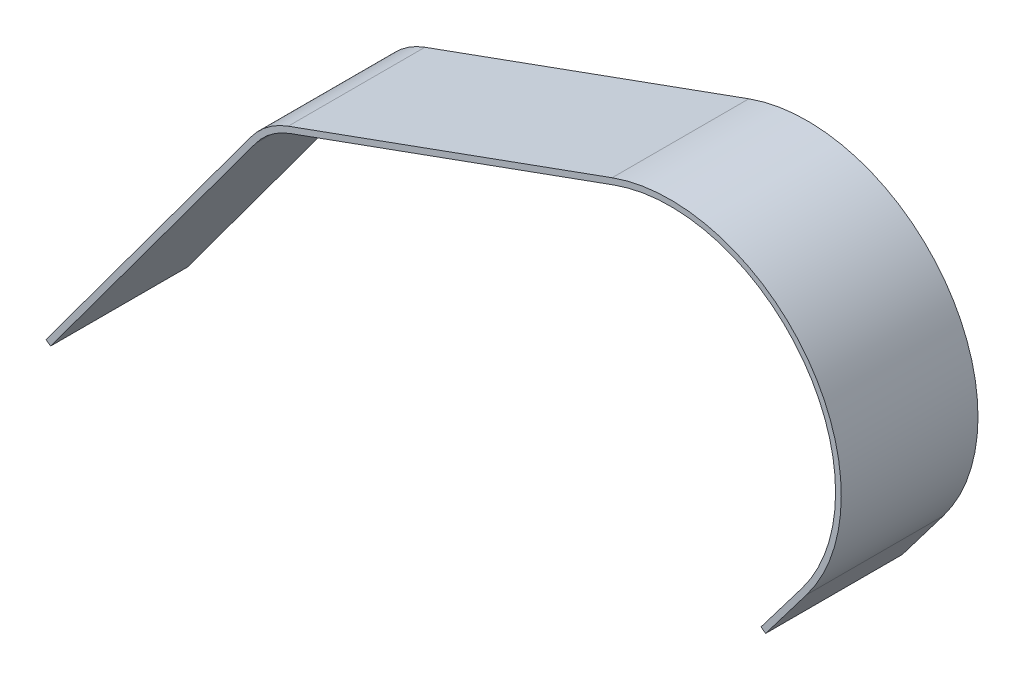
ISO-10303-21;
HEADER;
FILE_DESCRIPTION(('STEP AP214'),'2;1');
FILE_NAME('part.step','',(''),(''),'','','');
FILE_SCHEMA(('AUTOMOTIVE_DESIGN { 1 0 10303 214 1 1 1 1 }'));
ENDSEC;
DATA;
#1=APPLICATION_CONTEXT('core data for automotive mechanical design processes');
#2=APPLICATION_PROTOCOL_DEFINITION('international standard','automotive_design',2000,#1);
#3=PRODUCT_CONTEXT('',#1,'mechanical');
#4=PRODUCT('Part','Part','',(#3));
#5=PRODUCT_RELATED_PRODUCT_CATEGORY('part','',(#4));
#6=PRODUCT_DEFINITION_FORMATION('','',#4);
#7=PRODUCT_DEFINITION_CONTEXT('part definition',#1,'design');
#8=PRODUCT_DEFINITION('design','',#6,#7);
#9=PRODUCT_DEFINITION_SHAPE('','',#8);
#10=(LENGTH_UNIT() NAMED_UNIT(*) SI_UNIT(.MILLI.,.METRE.));
#11=(NAMED_UNIT(*) PLANE_ANGLE_UNIT() SI_UNIT($,.RADIAN.));
#12=(NAMED_UNIT(*) SI_UNIT($,.STERADIAN.) SOLID_ANGLE_UNIT());
#13=UNCERTAINTY_MEASURE_WITH_UNIT(LENGTH_MEASURE(1.E-05),#10,'distance_accuracy_value','');
#14=(GEOMETRIC_REPRESENTATION_CONTEXT(3) GLOBAL_UNCERTAINTY_ASSIGNED_CONTEXT((#13)) GLOBAL_UNIT_ASSIGNED_CONTEXT((#10,
#11,#12)) REPRESENTATION_CONTEXT('',''));
#15=CARTESIAN_POINT('',(0.,0.,0.));
#16=DIRECTION('',(0.,0.,1.));
#17=DIRECTION('',(1.,0.,0.));
#18=AXIS2_PLACEMENT_3D('',#15,#16,#17);
#19=CARTESIAN_POINT('',(-57.2077768085638,-14.4933568152173,76.2));
#20=DIRECTION('',(0.804862618408314,-0.593461174373618,0.));
#21=DIRECTION('',(0.593461174373618,0.804862618408314,0.));
#22=AXIS2_PLACEMENT_3D('',#19,#20,#21);
#23=PLANE('',#22);
#24=DIRECTION('',(-0.593461174373618,-0.804862618408313,0.));
#25=VECTOR('',#24,1.);
#26=CARTESIAN_POINT('',(-57.2077768085638,-14.4933568152173,0.));
#27=LINE('',#26,#25);
#28=CARTESIAN_POINT('',(-57.2077768085638,-14.4933568152173,0.));
#29=VERTEX_POINT('',#28);
#30=CARTESIAN_POINT('',(-171.530725157961,-169.54017626347,0.));
#31=VERTEX_POINT('',#30);
#32=EDGE_CURVE('E170',#29,#31,#27,.T.);
#33=ORIENTED_EDGE('',*,*,#32,.T.);
#34=DIRECTION('',(0.,0.,-1.));
#35=VECTOR('',#34,1.);
#36=CARTESIAN_POINT('',(-171.530725157961,-169.54017626347,76.2));
#37=LINE('',#36,#35);
#38=CARTESIAN_POINT('',(-171.530725157961,-169.54017626347,76.2));
#39=VERTEX_POINT('',#38);
#40=EDGE_CURVE('E11',#39,#31,#37,.T.);
#41=ORIENTED_EDGE('',*,*,#40,.F.);
#42=DIRECTION('',(-0.593461174373618,-0.804862618408313,0.));
#43=VECTOR('',#42,1.);
#44=CARTESIAN_POINT('',(-57.2077768085638,-14.4933568152173,76.2));
#45=LINE('',#44,#43);
#46=CARTESIAN_POINT('',(-57.2077768085638,-14.4933568152173,76.2));
#47=VERTEX_POINT('',#46);
#48=EDGE_CURVE('E114',#47,#39,#45,.T.);
#49=ORIENTED_EDGE('',*,*,#48,.F.);
#50=DIRECTION('',(0.,0.,-1.));
#51=VECTOR('',#50,1.);
#52=CARTESIAN_POINT('',(-57.2077768085638,-14.4933568152173,76.2));
#53=LINE('',#52,#51);
#54=EDGE_CURVE('E166',#47,#29,#53,.T.);
#55=ORIENTED_EDGE('',*,*,#54,.T.);
#56=EDGE_LOOP('',(#33,#41,#49,#55));
#57=FACE_BOUND('',#56,.T.);
#58=ADVANCED_FACE('F45',(#57),#23,.F.);
#59=CARTESIAN_POINT('',(-168.975286344515,-171.424415492106,76.2));
#60=DIRECTION('',(-0.593461174373618,-0.804862618408314,0.));
#61=DIRECTION('',(0.804862618408313,-0.593461174373618,0.));
#62=AXIS2_PLACEMENT_3D('',#59,#60,#61);
#63=PLANE('',#62);
#64=DIRECTION('',(-0.804862618408313,0.593461174373618,0.));
#65=VECTOR('',#64,1.);
#66=CARTESIAN_POINT('',(-168.975286344515,-171.424415492106,0.));
#67=LINE('',#66,#65);
#68=CARTESIAN_POINT('',(-168.975286344515,-171.424415492106,0.));
#69=VERTEX_POINT('',#68);
#70=EDGE_CURVE('E174',#69,#31,#67,.T.);
#71=ORIENTED_EDGE('',*,*,#70,.F.);
#72=DIRECTION('',(0.,0.,-1.));
#73=VECTOR('',#72,1.);
#74=CARTESIAN_POINT('',(-168.975286344515,-171.424415492106,76.2));
#75=LINE('',#74,#73);
#76=CARTESIAN_POINT('',(-168.975286344515,-171.424415492106,76.2));
#77=VERTEX_POINT('',#76);
#78=EDGE_CURVE('E54',#77,#69,#75,.T.);
#79=ORIENTED_EDGE('',*,*,#78,.F.);
#80=DIRECTION('',(-0.804862618408313,0.593461174373618,0.));
#81=VECTOR('',#80,1.);
#82=CARTESIAN_POINT('',(-168.975286344515,-171.424415492106,76.2));
#83=LINE('',#82,#81);
#84=EDGE_CURVE('E257',#77,#39,#83,.T.);
#85=ORIENTED_EDGE('',*,*,#84,.T.);
#86=ORIENTED_EDGE('',*,*,#40,.T.);
#87=EDGE_LOOP('',(#71,#79,#85,#86));
#88=FACE_BOUND('',#87,.T.);
#89=ADVANCED_FACE('F244',(#88),#63,.T.);
#90=CARTESIAN_POINT('',(-54.6523379951174,-16.3775960438536,76.2));
#91=DIRECTION('',(0.804862618408313,-0.593461174373618,0.));
#92=DIRECTION('',(0.593461174373618,0.804862618408313,0.));
#93=AXIS2_PLACEMENT_3D('',#90,#91,#92);
#94=PLANE('',#93);
#95=DIRECTION('',(-0.593461174373618,-0.804862618408314,0.));
#96=VECTOR('',#95,1.);
#97=CARTESIAN_POINT('',(-54.6523379951174,-16.3775960438536,0.));
#98=LINE('',#97,#96);
#99=CARTESIAN_POINT('',(-54.6523379951174,-16.3775960438536,0.));
#100=VERTEX_POINT('',#99);
#101=EDGE_CURVE('E178',#100,#69,#98,.T.);
#102=ORIENTED_EDGE('',*,*,#101,.F.);
#103=DIRECTION('',(0.,0.,-1.));
#104=VECTOR('',#103,1.);
#105=CARTESIAN_POINT('',(-54.6523379951174,-16.3775960438536,76.2));
#106=LINE('',#105,#104);
#107=CARTESIAN_POINT('',(-54.6523379951174,-16.3775960438536,76.2));
#108=VERTEX_POINT('',#107);
#109=EDGE_CURVE('E232',#108,#100,#106,.T.);
#110=ORIENTED_EDGE('',*,*,#109,.F.);
#111=DIRECTION('',(-0.593461174373618,-0.804862618408314,0.));
#112=VECTOR('',#111,1.);
#113=CARTESIAN_POINT('',(-54.6523379951174,-16.3775960438536,76.2));
#114=LINE('',#113,#112);
#115=EDGE_CURVE('E241',#108,#77,#114,.T.);
#116=ORIENTED_EDGE('',*,*,#115,.T.);
#117=ORIENTED_EDGE('',*,*,#78,.T.);
#118=EDGE_LOOP('',(#102,#110,#116,#117));
#119=FACE_BOUND('',#118,.T.);
#120=ADVANCED_FACE('F239',(#119),#94,.T.);
#121=CARTESIAN_POINT('',(-21.4316334203143,-40.8727060161246,76.2));
#122=DIRECTION('',(0.,0.,-1.));
#123=DIRECTION('',(-1.,0.,0.));
#124=AXIS2_PLACEMENT_3D('',#121,#122,#123);
#125=CYLINDRICAL_SURFACE('',#124,41.275);
#126=CARTESIAN_POINT('',(-21.4316334203143,-40.8727060161246,0.));
#127=DIRECTION('',(0.,0.,1.));
#128=DIRECTION('',(1.,0.,0.));
#129=AXIS2_PLACEMENT_3D('',#126,#127,#128);
#130=CIRCLE('',#129,41.275);
#131=CARTESIAN_POINT('',(-35.4870375264377,-2.06457232724997,0.));
#132=VERTEX_POINT('',#131);
#133=EDGE_CURVE('E182',#132,#100,#130,.T.);
#134=ORIENTED_EDGE('',*,*,#133,.F.);
#135=DIRECTION('',(0.,0.,-1.));
#136=VECTOR('',#135,1.);
#137=CARTESIAN_POINT('',(-35.4870375264377,-2.06457232724997,76.2));
#138=LINE('',#137,#136);
#139=CARTESIAN_POINT('',(-35.4870375264377,-2.06457232724997,76.2));
#140=VERTEX_POINT('',#139);
#141=EDGE_CURVE('E229',#140,#132,#138,.T.);
#142=ORIENTED_EDGE('',*,*,#141,.F.);
#143=CARTESIAN_POINT('',(-21.4316334203143,-40.8727060161246,76.2));
#144=DIRECTION('',(0.,0.,1.));
#145=DIRECTION('',(1.,0.,0.));
#146=AXIS2_PLACEMENT_3D('',#143,#144,#145);
#147=CIRCLE('',#146,41.275);
#148=EDGE_CURVE('E254',#140,#108,#147,.T.);
#149=ORIENTED_EDGE('',*,*,#148,.T.);
#150=ORIENTED_EDGE('',*,*,#109,.T.);
#151=EDGE_LOOP('',(#134,#142,#149,#150));
#152=FACE_BOUND('',#151,.T.);
#153=ADVANCED_FACE('F251',(#152),#125,.F.);
#154=CARTESIAN_POINT('',(-35.4870375264377,-2.06457232724998,76.2));
#155=DIRECTION('',(0.340530687004807,-0.940233402516649,0.));
#156=DIRECTION('',(0.940233402516649,0.340530687004807,0.));
#157=AXIS2_PLACEMENT_3D('',#154,#155,#156);
#158=PLANE('',#157);
#159=DIRECTION('',(-0.940233402516649,-0.340530687004807,0.));
#160=VECTOR('',#159,1.);
#161=CARTESIAN_POINT('',(-35.4870375264377,-2.06457232724998,0.));
#162=LINE('',#161,#160);
#163=CARTESIAN_POINT('',(145.033742322665,63.3158587615827,0.));
#164=VERTEX_POINT('',#163);
#165=EDGE_CURVE('E186',#164,#132,#162,.T.);
#166=ORIENTED_EDGE('',*,*,#165,.F.);
#167=DIRECTION('',(0.,0.,-1.));
#168=VECTOR('',#167,1.);
#169=CARTESIAN_POINT('',(145.033742322665,63.3158587615827,76.2));
#170=LINE('',#169,#168);
#171=CARTESIAN_POINT('',(145.033742322665,63.3158587615827,76.2));
#172=VERTEX_POINT('',#171);
#173=EDGE_CURVE('E226',#172,#164,#170,.T.);
#174=ORIENTED_EDGE('',*,*,#173,.F.);
#175=DIRECTION('',(-0.940233402516649,-0.340530687004807,0.));
#176=VECTOR('',#175,1.);
#177=CARTESIAN_POINT('',(-35.4870375264377,-2.06457232724998,76.2));
#178=LINE('',#177,#176);
#179=EDGE_CURVE('E262',#172,#140,#178,.T.);
#180=ORIENTED_EDGE('',*,*,#179,.T.);
#181=ORIENTED_EDGE('',*,*,#141,.T.);
#182=EDGE_LOOP('',(#166,#174,#180,#181));
#183=FACE_BOUND('',#182,.T.);
#184=ADVANCED_FACE('F369',(#183),#158,.T.);
#185=CARTESIAN_POINT('',(176.388105328633,-23.2561317751377,76.2));
#186=DIRECTION('',(0.,0.,-1.));
#187=DIRECTION('',(-1.,0.,0.));
#188=AXIS2_PLACEMENT_3D('',#185,#186,#187);
#189=CYLINDRICAL_SURFACE('',#188,92.075);
#190=CARTESIAN_POINT('',(176.388105328633,-23.2561317751377,0.));
#191=DIRECTION('',(0.,0.,1.));
#192=DIRECTION('',(1.,0.,0.));
#193=AXIS2_PLACEMENT_3D('',#190,#191,#192);
#194=CIRCLE('',#193,92.075);
#195=CARTESIAN_POINT('',(249.735479647556,-78.9155272580188,0.));
#196=VERTEX_POINT('',#195);
#197=EDGE_CURVE('E190',#196,#164,#194,.T.);
#198=ORIENTED_EDGE('',*,*,#197,.F.);
#199=DIRECTION('',(0.,0.,-1.));
#200=VECTOR('',#199,1.);
#201=CARTESIAN_POINT('',(249.735479647556,-78.9155272580188,76.2));
#202=LINE('',#201,#200);
#203=CARTESIAN_POINT('',(249.735479647556,-78.9155272580188,76.2));
#204=VERTEX_POINT('',#203);
#205=EDGE_CURVE('E223',#204,#196,#202,.T.);
#206=ORIENTED_EDGE('',*,*,#205,.F.);
#207=CARTESIAN_POINT('',(176.388105328633,-23.2561317751377,76.2));
#208=DIRECTION('',(0.,0.,1.));
#209=DIRECTION('',(1.,0.,0.));
#210=AXIS2_PLACEMENT_3D('',#207,#208,#209);
#211=CIRCLE('',#210,92.075);
#212=EDGE_CURVE('E269',#204,#172,#211,.T.);
#213=ORIENTED_EDGE('',*,*,#212,.T.);
#214=ORIENTED_EDGE('',*,*,#173,.T.);
#215=EDGE_LOOP('',(#198,#206,#213,#214));
#216=FACE_BOUND('',#215,.T.);
#217=ADVANCED_FACE('F360',(#216),#189,.F.);
#218=CARTESIAN_POINT('',(226.939831580388,-108.9553959472,76.2));
#219=DIRECTION('',(-0.796604662708913,0.604500629735337,0.));
#220=DIRECTION('',(-0.604500629735337,-0.796604662708913,0.));
#221=AXIS2_PLACEMENT_3D('',#218,#219,#220);
#222=PLANE('',#221);
#223=DIRECTION('',(0.604500629735337,0.796604662708913,0.));
#224=VECTOR('',#223,1.);
#225=CARTESIAN_POINT('',(226.939831580388,-108.9553959472,0.));
#226=LINE('',#225,#224);
#227=CARTESIAN_POINT('',(226.939831580388,-108.9553959472,0.));
#228=VERTEX_POINT('',#227);
#229=EDGE_CURVE('E194',#228,#196,#226,.T.);
#230=ORIENTED_EDGE('',*,*,#229,.F.);
#231=DIRECTION('',(0.,0.,-1.));
#232=VECTOR('',#231,1.);
#233=CARTESIAN_POINT('',(226.939831580388,-108.9553959472,76.2));
#234=LINE('',#233,#232);
#235=CARTESIAN_POINT('',(226.939831580388,-108.9553959472,76.2));
#236=VERTEX_POINT('',#235);
#237=EDGE_CURVE('E220',#236,#228,#234,.T.);
#238=ORIENTED_EDGE('',*,*,#237,.F.);
#239=DIRECTION('',(0.604500629735337,0.796604662708913,0.));
#240=VECTOR('',#239,1.);
#241=CARTESIAN_POINT('',(226.939831580388,-108.9553959472,76.2));
#242=LINE('',#241,#240);
#243=EDGE_CURVE('E273',#236,#204,#242,.T.);
#244=ORIENTED_EDGE('',*,*,#243,.T.);
#245=ORIENTED_EDGE('',*,*,#205,.T.);
#246=EDGE_LOOP('',(#230,#238,#244,#245));
#247=FACE_BOUND('',#246,.T.);
#248=ADVANCED_FACE('F288',(#247),#222,.T.);
#249=CARTESIAN_POINT('',(229.469051384489,-110.87468544661,76.2));
#250=DIRECTION('',(-0.60450062973534,-0.796604662708911,0.));
#251=DIRECTION('',(0.796604662708911,-0.60450062973534,0.));
#252=AXIS2_PLACEMENT_3D('',#249,#250,#251);
#253=PLANE('',#252);
#254=DIRECTION('',(-0.796604662708911,0.60450062973534,0.));
#255=VECTOR('',#254,1.);
#256=CARTESIAN_POINT('',(229.469051384489,-110.87468544661,0.));
#257=LINE('',#256,#255);
#258=CARTESIAN_POINT('',(229.469051384489,-110.87468544661,0.));
#259=VERTEX_POINT('',#258);
#260=EDGE_CURVE('E198',#259,#228,#257,.T.);
#261=ORIENTED_EDGE('',*,*,#260,.F.);
#262=DIRECTION('',(0.,0.,-1.));
#263=VECTOR('',#262,1.);
#264=CARTESIAN_POINT('',(229.469051384489,-110.87468544661,76.2));
#265=LINE('',#264,#263);
#266=CARTESIAN_POINT('',(229.469051384489,-110.87468544661,76.2));
#267=VERTEX_POINT('',#266);
#268=EDGE_CURVE('E217',#267,#259,#265,.T.);
#269=ORIENTED_EDGE('',*,*,#268,.F.);
#270=DIRECTION('',(-0.796604662708911,0.60450062973534,0.));
#271=VECTOR('',#270,1.);
#272=CARTESIAN_POINT('',(229.469051384489,-110.87468544661,76.2));
#273=LINE('',#272,#271);
#274=EDGE_CURVE('E277',#267,#236,#273,.T.);
#275=ORIENTED_EDGE('',*,*,#274,.T.);
#276=ORIENTED_EDGE('',*,*,#237,.T.);
#277=EDGE_LOOP('',(#261,#269,#275,#276));
#278=FACE_BOUND('',#277,.T.);
#279=ADVANCED_FACE('F283',(#278),#253,.T.);
#280=CARTESIAN_POINT('',(229.469051384489,-110.87468544661,76.2));
#281=DIRECTION('',(-0.796604662708913,0.604500629735337,0.));
#282=DIRECTION('',(-0.604500629735337,-0.796604662708913,0.));
#283=AXIS2_PLACEMENT_3D('',#280,#281,#282);
#284=PLANE('',#283);
#285=DIRECTION('',(0.604500629735337,0.796604662708913,0.));
#286=VECTOR('',#285,1.);
#287=CARTESIAN_POINT('',(229.469051384489,-110.87468544661,0.));
#288=LINE('',#287,#286);
#289=CARTESIAN_POINT('',(252.264699451657,-80.8348167574284,0.));
#290=VERTEX_POINT('',#289);
#291=EDGE_CURVE('E202',#259,#290,#288,.T.);
#292=ORIENTED_EDGE('',*,*,#291,.T.);
#293=DIRECTION('',(0.,0.,-1.));
#294=VECTOR('',#293,1.);
#295=CARTESIAN_POINT('',(252.264699451657,-80.8348167574284,76.2));
#296=LINE('',#295,#294);
#297=CARTESIAN_POINT('',(252.264699451657,-80.8348167574284,76.2));
#298=VERTEX_POINT('',#297);
#299=EDGE_CURVE('E159',#298,#290,#296,.T.);
#300=ORIENTED_EDGE('',*,*,#299,.F.);
#301=DIRECTION('',(0.604500629735337,0.796604662708913,0.));
#302=VECTOR('',#301,1.);
#303=CARTESIAN_POINT('',(229.469051384489,-110.87468544661,76.2));
#304=LINE('',#303,#302);
#305=EDGE_CURVE('E148',#267,#298,#304,.T.);
#306=ORIENTED_EDGE('',*,*,#305,.F.);
#307=ORIENTED_EDGE('',*,*,#268,.T.);
#308=EDGE_LOOP('',(#292,#300,#306,#307));
#309=FACE_BOUND('',#308,.T.);
#310=ADVANCED_FACE('F292',(#309),#284,.F.);
#311=CARTESIAN_POINT('',(176.388105328633,-23.2561317751377,76.2));
#312=DIRECTION('',(0.,0.,-1.));
#313=DIRECTION('',(-1.,0.,0.));
#314=AXIS2_PLACEMENT_3D('',#311,#312,#313);
#315=CYLINDRICAL_SURFACE('',#314,95.25);
#316=CARTESIAN_POINT('',(176.388105328633,-23.2561317751377,0.));
#317=DIRECTION('',(0.,0.,1.));
#318=DIRECTION('',(-1.,0.,0.));
#319=AXIS2_PLACEMENT_3D('',#316,#317,#318);
#320=CIRCLE('',#319,95.25);
#321=CARTESIAN_POINT('',(143.952557391425,66.301099814573,0.));
#322=VERTEX_POINT('',#321);
#323=EDGE_CURVE('E157',#290,#322,#320,.T.);
#324=ORIENTED_EDGE('',*,*,#323,.T.);
#325=DIRECTION('',(0.,0.,-1.));
#326=VECTOR('',#325,1.);
#327=CARTESIAN_POINT('',(143.952557391425,66.301099814573,76.2));
#328=LINE('',#327,#326);
#329=CARTESIAN_POINT('',(143.952557391425,66.301099814573,76.2));
#330=VERTEX_POINT('',#329);
#331=EDGE_CURVE('E154',#330,#322,#328,.T.);
#332=ORIENTED_EDGE('',*,*,#331,.F.);
#333=CARTESIAN_POINT('',(176.388105328633,-23.2561317751377,76.2));
#334=DIRECTION('',(0.,0.,1.));
#335=DIRECTION('',(-1.,0.,0.));
#336=AXIS2_PLACEMENT_3D('',#333,#334,#335);
#337=CIRCLE('',#336,95.25);
#338=EDGE_CURVE('E141',#298,#330,#337,.T.);
#339=ORIENTED_EDGE('',*,*,#338,.F.);
#340=ORIENTED_EDGE('',*,*,#299,.T.);
#341=EDGE_LOOP('',(#324,#332,#339,#340));
#342=FACE_BOUND('',#341,.T.);
#343=ADVANCED_FACE('F155',(#342),#315,.T.);
#344=CARTESIAN_POINT('',(-36.568222457678,0.920668725740384,76.2));
#345=DIRECTION('',(0.340530687004807,-0.940233402516649,0.));
#346=DIRECTION('',(0.940233402516649,0.340530687004807,0.));
#347=AXIS2_PLACEMENT_3D('',#344,#345,#346);
#348=PLANE('',#347);
#349=DIRECTION('',(-0.940233402516649,-0.340530687004807,0.));
#350=VECTOR('',#349,1.);
#351=CARTESIAN_POINT('',(-36.568222457678,0.920668725740384,0.));
#352=LINE('',#351,#350);
#353=CARTESIAN_POINT('',(-36.568222457678,0.920668725740384,0.));
#354=VERTEX_POINT('',#353);
#355=EDGE_CURVE('E102',#322,#354,#352,.T.);
#356=ORIENTED_EDGE('',*,*,#355,.T.);
#357=DIRECTION('',(0.,0.,-1.));
#358=VECTOR('',#357,1.);
#359=CARTESIAN_POINT('',(-36.568222457678,0.920668725740384,76.2));
#360=LINE('',#359,#358);
#361=CARTESIAN_POINT('',(-36.568222457678,0.920668725740384,76.2));
#362=VERTEX_POINT('',#361);
#363=EDGE_CURVE('E160',#362,#354,#360,.T.);
#364=ORIENTED_EDGE('',*,*,#363,.F.);
#365=DIRECTION('',(-0.940233402516649,-0.340530687004807,0.));
#366=VECTOR('',#365,1.);
#367=CARTESIAN_POINT('',(-36.568222457678,0.920668725740384,76.2));
#368=LINE('',#367,#366);
#369=EDGE_CURVE('E145',#330,#362,#368,.T.);
#370=ORIENTED_EDGE('',*,*,#369,.F.);
#371=ORIENTED_EDGE('',*,*,#331,.T.);
#372=EDGE_LOOP('',(#356,#364,#370,#371));
#373=FACE_BOUND('',#372,.T.);
#374=ADVANCED_FACE('F162',(#373),#348,.F.);
#375=CARTESIAN_POINT('',(-21.4316334203143,-40.8727060161246,76.2));
#376=DIRECTION('',(0.,0.,-1.));
#377=DIRECTION('',(-1.,0.,0.));
#378=AXIS2_PLACEMENT_3D('',#375,#376,#377);
#379=CYLINDRICAL_SURFACE('',#378,44.45);
#380=CARTESIAN_POINT('',(-21.4316334203143,-40.8727060161246,0.));
#381=DIRECTION('',(0.,0.,1.));
#382=DIRECTION('',(-1.,0.,0.));
#383=AXIS2_PLACEMENT_3D('',#380,#381,#382);
#384=CIRCLE('',#383,44.45);
#385=EDGE_CURVE('E108',#354,#29,#384,.T.);
#386=ORIENTED_EDGE('',*,*,#385,.T.);
#387=ORIENTED_EDGE('',*,*,#54,.F.);
#388=CARTESIAN_POINT('',(-21.4316334203143,-40.8727060161246,76.2));
#389=DIRECTION('',(0.,0.,1.));
#390=DIRECTION('',(-1.,0.,0.));
#391=AXIS2_PLACEMENT_3D('',#388,#389,#390);
#392=CIRCLE('',#391,44.45);
#393=EDGE_CURVE('E62',#362,#47,#392,.T.);
#394=ORIENTED_EDGE('',*,*,#393,.F.);
#395=ORIENTED_EDGE('',*,*,#363,.T.);
#396=EDGE_LOOP('',(#386,#387,#394,#395));
#397=FACE_BOUND('',#396,.T.);
#398=ADVANCED_FACE('F306',(#397),#379,.T.);
#399=CARTESIAN_POINT('',(-21.4316334203143,-40.8727060161246,76.2));
#400=DIRECTION('',(0.,0.,1.));
#401=DIRECTION('',(1.,0.,0.));
#402=AXIS2_PLACEMENT_3D('',#399,#400,#401);
#403=PLANE('',#402);
#404=ORIENTED_EDGE('',*,*,#48,.T.);
#405=ORIENTED_EDGE('',*,*,#84,.F.);
#406=ORIENTED_EDGE('',*,*,#115,.F.);
#407=ORIENTED_EDGE('',*,*,#148,.F.);
#408=ORIENTED_EDGE('',*,*,#179,.F.);
#409=ORIENTED_EDGE('',*,*,#212,.F.);
#410=ORIENTED_EDGE('',*,*,#243,.F.);
#411=ORIENTED_EDGE('',*,*,#274,.F.);
#412=ORIENTED_EDGE('',*,*,#305,.T.);
#413=ORIENTED_EDGE('',*,*,#338,.T.);
#414=ORIENTED_EDGE('',*,*,#369,.T.);
#415=ORIENTED_EDGE('',*,*,#393,.T.);
#416=EDGE_LOOP('',(#404,#405,#406,#407,#408,#409,#410,#411,#412,#413,#414,#415));
#417=FACE_BOUND('',#416,.T.);
#418=ADVANCED_FACE('F143',(#417),#403,.T.);
#419=CARTESIAN_POINT('',(-21.4316334203143,-40.8727060161246,0.));
#420=DIRECTION('',(0.,0.,1.));
#421=DIRECTION('',(1.,0.,0.));
#422=AXIS2_PLACEMENT_3D('',#419,#420,#421);
#423=PLANE('',#422);
#424=ORIENTED_EDGE('',*,*,#32,.F.);
#425=ORIENTED_EDGE('',*,*,#385,.F.);
#426=ORIENTED_EDGE('',*,*,#355,.F.);
#427=ORIENTED_EDGE('',*,*,#323,.F.);
#428=ORIENTED_EDGE('',*,*,#291,.F.);
#429=ORIENTED_EDGE('',*,*,#260,.T.);
#430=ORIENTED_EDGE('',*,*,#229,.T.);
#431=ORIENTED_EDGE('',*,*,#197,.T.);
#432=ORIENTED_EDGE('',*,*,#165,.T.);
#433=ORIENTED_EDGE('',*,*,#133,.T.);
#434=ORIENTED_EDGE('',*,*,#101,.T.);
#435=ORIENTED_EDGE('',*,*,#70,.T.);
#436=EDGE_LOOP('',(#424,#425,#426,#427,#428,#429,#430,#431,#432,#433,#434,#435));
#437=FACE_BOUND('',#436,.T.);
#438=ADVANCED_FACE('F247',(#437),#423,.F.);
#439=CLOSED_SHELL('',(#58,#89,#120,#153,#184,#217,#248,#279,#310,#343,#374,#398,#418,#438));
#440=MANIFOLD_SOLID_BREP('B2',#439);
#441=ADVANCED_BREP_SHAPE_REPRESENTATION('',(#18,#440),#14);
#442=SHAPE_DEFINITION_REPRESENTATION(#9,#441);
ENDSEC;
END-ISO-10303-21;
